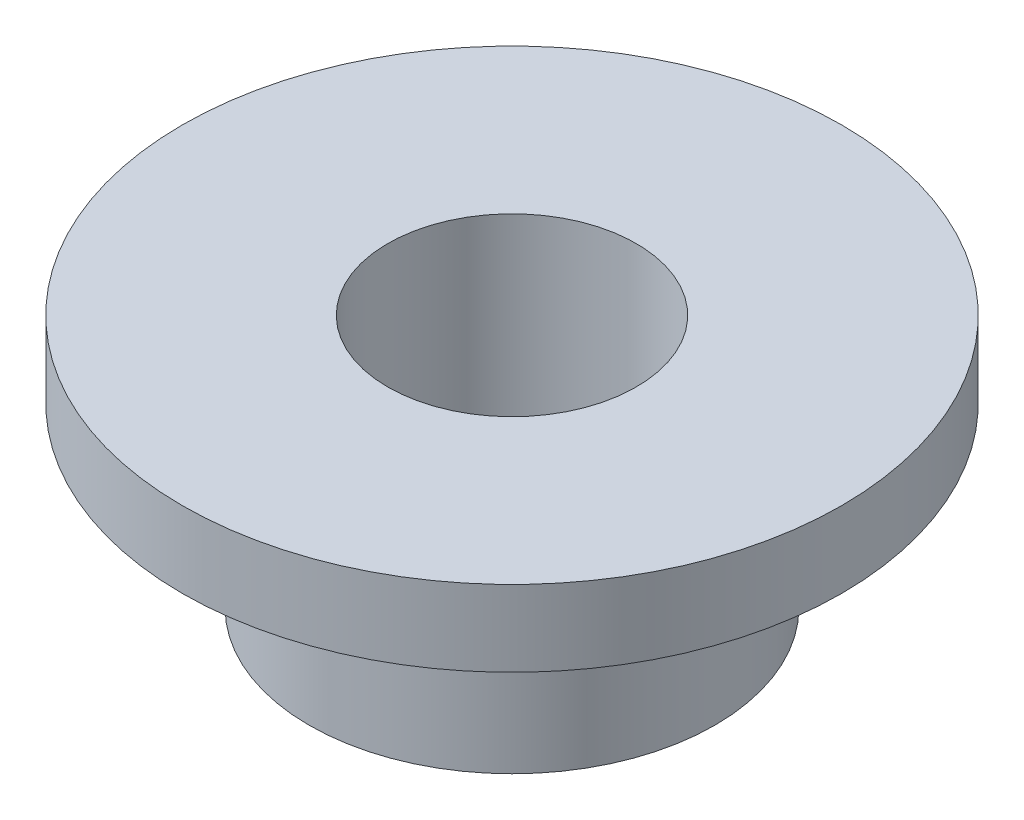
ISO-10303-21;
HEADER;
FILE_DESCRIPTION(('STEP AP214'),'2;1');
FILE_NAME('part.step','',(''),(''),'','','');
FILE_SCHEMA(('AUTOMOTIVE_DESIGN { 1 0 10303 214 1 1 1 1 }'));
ENDSEC;
DATA;
#1=APPLICATION_CONTEXT('core data for automotive mechanical design processes');
#2=APPLICATION_PROTOCOL_DEFINITION('international standard','automotive_design',2000,#1);
#3=PRODUCT_CONTEXT('',#1,'mechanical');
#4=PRODUCT('Part','Part','',(#3));
#5=PRODUCT_RELATED_PRODUCT_CATEGORY('part','',(#4));
#6=PRODUCT_DEFINITION_FORMATION('','',#4);
#7=PRODUCT_DEFINITION_CONTEXT('part definition',#1,'design');
#8=PRODUCT_DEFINITION('design','',#6,#7);
#9=PRODUCT_DEFINITION_SHAPE('','',#8);
#10=(LENGTH_UNIT() NAMED_UNIT(*) SI_UNIT(.MILLI.,.METRE.));
#11=(NAMED_UNIT(*) PLANE_ANGLE_UNIT() SI_UNIT($,.RADIAN.));
#12=(NAMED_UNIT(*) SI_UNIT($,.STERADIAN.) SOLID_ANGLE_UNIT());
#13=UNCERTAINTY_MEASURE_WITH_UNIT(LENGTH_MEASURE(1.E-05),#10,'distance_accuracy_value','');
#14=(GEOMETRIC_REPRESENTATION_CONTEXT(3) GLOBAL_UNCERTAINTY_ASSIGNED_CONTEXT((#13)) GLOBAL_UNIT_ASSIGNED_CONTEXT((#10,
#11,#12)) REPRESENTATION_CONTEXT('',''));
#15=CARTESIAN_POINT('',(0.,0.,0.));
#16=DIRECTION('',(0.,0.,1.));
#17=DIRECTION('',(1.,0.,0.));
#18=AXIS2_PLACEMENT_3D('',#15,#16,#17);
#19=CARTESIAN_POINT('',(0.,5.,0.));
#20=DIRECTION('',(0.,-1.,0.));
#21=DIRECTION('',(0.,0.,-1.));
#22=AXIS2_PLACEMENT_3D('',#19,#20,#21);
#23=CYLINDRICAL_SURFACE('',#22,4.);
#24=CARTESIAN_POINT('',(0.,0.,0.));
#25=DIRECTION('',(0.,1.,0.));
#26=DIRECTION('',(0.,0.,1.));
#27=AXIS2_PLACEMENT_3D('',#24,#25,#26);
#28=CIRCLE('',#27,4.);
#29=CARTESIAN_POINT('',(0.,0.,4.));
#30=VERTEX_POINT('',#29);
#31=EDGE_CURVE('E43',#30,#30,#28,.T.);
#32=ORIENTED_EDGE('',*,*,#31,.T.);
#33=EDGE_LOOP('',(#32));
#34=FACE_BOUND('',#33,.T.);
#35=CARTESIAN_POINT('',(0.,3.5,0.));
#36=DIRECTION('',(0.,1.,0.));
#37=DIRECTION('',(0.,0.,1.));
#38=AXIS2_PLACEMENT_3D('',#35,#36,#37);
#39=CIRCLE('',#38,4.);
#40=CARTESIAN_POINT('',(0.,3.5,4.));
#41=VERTEX_POINT('',#40);
#42=EDGE_CURVE('E10',#41,#41,#39,.T.);
#43=ORIENTED_EDGE('',*,*,#42,.F.);
#44=EDGE_LOOP('',(#43));
#45=FACE_BOUND('',#44,.T.);
#46=ADVANCED_FACE('F32',(#34,#45),#23,.T.);
#47=CARTESIAN_POINT('',(0.,5.,0.));
#48=DIRECTION('',(0.,-1.,0.));
#49=DIRECTION('',(0.,0.,-1.));
#50=AXIS2_PLACEMENT_3D('',#47,#48,#49);
#51=CYLINDRICAL_SURFACE('',#50,2.45);
#52=CARTESIAN_POINT('',(0.,5.,0.));
#53=DIRECTION('',(0.,1.,0.));
#54=DIRECTION('',(0.,0.,1.));
#55=AXIS2_PLACEMENT_3D('',#52,#53,#54);
#56=CIRCLE('',#55,2.45);
#57=CARTESIAN_POINT('',(0.,5.,2.45));
#58=VERTEX_POINT('',#57);
#59=EDGE_CURVE('E39',#58,#58,#56,.T.);
#60=ORIENTED_EDGE('',*,*,#59,.T.);
#61=EDGE_LOOP('',(#60));
#62=FACE_BOUND('',#61,.T.);
#63=CARTESIAN_POINT('',(0.,0.,0.));
#64=DIRECTION('',(0.,1.,0.));
#65=DIRECTION('',(0.,0.,1.));
#66=AXIS2_PLACEMENT_3D('',#63,#64,#65);
#67=CIRCLE('',#66,2.45);
#68=CARTESIAN_POINT('',(0.,0.,2.45));
#69=VERTEX_POINT('',#68);
#70=EDGE_CURVE('E48',#69,#69,#67,.T.);
#71=ORIENTED_EDGE('',*,*,#70,.F.);
#72=EDGE_LOOP('',(#71));
#73=FACE_BOUND('',#72,.T.);
#74=ADVANCED_FACE('F34',(#62,#73),#51,.F.);
#75=CARTESIAN_POINT('',(0.,5.,0.));
#76=DIRECTION('',(0.,1.,0.));
#77=DIRECTION('',(0.,0.,1.));
#78=AXIS2_PLACEMENT_3D('',#75,#76,#77);
#79=PLANE('',#78);
#80=ORIENTED_EDGE('',*,*,#59,.F.);
#81=EDGE_LOOP('',(#80));
#82=FACE_BOUND('',#81,.T.);
#83=CARTESIAN_POINT('',(0.,5.,0.));
#84=DIRECTION('',(0.,1.,0.));
#85=DIRECTION('',(0.,0.,1.));
#86=AXIS2_PLACEMENT_3D('',#83,#84,#85);
#87=CIRCLE('',#86,6.5);
#88=CARTESIAN_POINT('',(0.,5.,6.5));
#89=VERTEX_POINT('',#88);
#90=EDGE_CURVE('E54',#89,#89,#87,.T.);
#91=ORIENTED_EDGE('',*,*,#90,.T.);
#92=EDGE_LOOP('',(#91));
#93=FACE_BOUND('',#92,.T.);
#94=ADVANCED_FACE('F79',(#82,#93),#79,.T.);
#95=CARTESIAN_POINT('',(0.,0.,0.));
#96=DIRECTION('',(0.,1.,0.));
#97=DIRECTION('',(0.,0.,1.));
#98=AXIS2_PLACEMENT_3D('',#95,#96,#97);
#99=PLANE('',#98);
#100=ORIENTED_EDGE('',*,*,#70,.T.);
#101=EDGE_LOOP('',(#100));
#102=FACE_BOUND('',#101,.T.);
#103=ORIENTED_EDGE('',*,*,#31,.F.);
#104=EDGE_LOOP('',(#103));
#105=FACE_BOUND('',#104,.T.);
#106=ADVANCED_FACE('F71',(#102,#105),#99,.F.);
#107=CARTESIAN_POINT('',(0.,5.,0.));
#108=DIRECTION('',(0.,-1.,0.));
#109=DIRECTION('',(0.,0.,-1.));
#110=AXIS2_PLACEMENT_3D('',#107,#108,#109);
#111=CYLINDRICAL_SURFACE('',#110,6.5);
#112=ORIENTED_EDGE('',*,*,#90,.F.);
#113=EDGE_LOOP('',(#112));
#114=FACE_BOUND('',#113,.T.);
#115=CARTESIAN_POINT('',(0.,3.5,0.));
#116=DIRECTION('',(0.,1.,0.));
#117=DIRECTION('',(0.,0.,1.));
#118=AXIS2_PLACEMENT_3D('',#115,#116,#117);
#119=CIRCLE('',#118,6.5);
#120=CARTESIAN_POINT('',(0.,3.5,6.5));
#121=VERTEX_POINT('',#120);
#122=EDGE_CURVE('E51',#121,#121,#119,.T.);
#123=ORIENTED_EDGE('',*,*,#122,.T.);
#124=EDGE_LOOP('',(#123));
#125=FACE_BOUND('',#124,.T.);
#126=ADVANCED_FACE('F63',(#114,#125),#111,.T.);
#127=CARTESIAN_POINT('',(0.,3.5,0.));
#128=DIRECTION('',(0.,1.,0.));
#129=DIRECTION('',(0.,0.,1.));
#130=AXIS2_PLACEMENT_3D('',#127,#128,#129);
#131=PLANE('',#130);
#132=ORIENTED_EDGE('',*,*,#42,.T.);
#133=EDGE_LOOP('',(#132));
#134=FACE_BOUND('',#133,.T.);
#135=ORIENTED_EDGE('',*,*,#122,.F.);
#136=EDGE_LOOP('',(#135));
#137=FACE_BOUND('',#136,.T.);
#138=ADVANCED_FACE('F65',(#134,#137),#131,.F.);
#139=CLOSED_SHELL('',(#46,#74,#94,#106,#126,#138));
#140=MANIFOLD_SOLID_BREP('B2',#139);
#141=ADVANCED_BREP_SHAPE_REPRESENTATION('',(#18,#140),#14);
#142=SHAPE_DEFINITION_REPRESENTATION(#9,#141);
ENDSEC;
END-ISO-10303-21;
